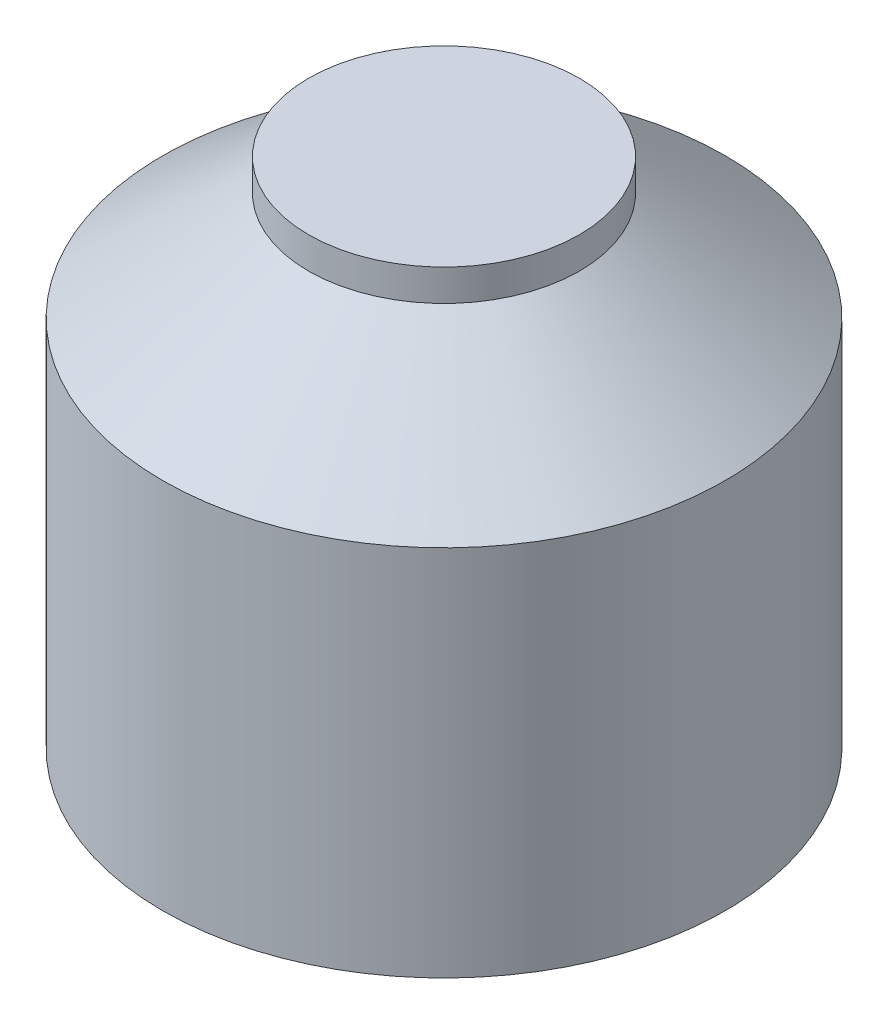
ISO-10303-21;
HEADER;
FILE_DESCRIPTION(('STEP AP214'),'2;1');
FILE_NAME('part.step','',(''),(''),'','','');
FILE_SCHEMA(('AUTOMOTIVE_DESIGN { 1 0 10303 214 1 1 1 1 }'));
ENDSEC;
DATA;
#1=APPLICATION_CONTEXT('core data for automotive mechanical design processes');
#2=APPLICATION_PROTOCOL_DEFINITION('international standard','automotive_design',2000,#1);
#3=PRODUCT_CONTEXT('',#1,'mechanical');
#4=PRODUCT('Part','Part','',(#3));
#5=PRODUCT_RELATED_PRODUCT_CATEGORY('part','',(#4));
#6=PRODUCT_DEFINITION_FORMATION('','',#4);
#7=PRODUCT_DEFINITION_CONTEXT('part definition',#1,'design');
#8=PRODUCT_DEFINITION('design','',#6,#7);
#9=PRODUCT_DEFINITION_SHAPE('','',#8);
#10=(LENGTH_UNIT() NAMED_UNIT(*) SI_UNIT(.MILLI.,.METRE.));
#11=(NAMED_UNIT(*) PLANE_ANGLE_UNIT() SI_UNIT($,.RADIAN.));
#12=(NAMED_UNIT(*) SI_UNIT($,.STERADIAN.) SOLID_ANGLE_UNIT());
#13=UNCERTAINTY_MEASURE_WITH_UNIT(LENGTH_MEASURE(1.E-05),#10,'distance_accuracy_value','');
#14=(GEOMETRIC_REPRESENTATION_CONTEXT(3) GLOBAL_UNCERTAINTY_ASSIGNED_CONTEXT((#13)) GLOBAL_UNIT_ASSIGNED_CONTEXT((#10,
#11,#12)) REPRESENTATION_CONTEXT('',''));
#15=CARTESIAN_POINT('',(0.,0.,0.));
#16=DIRECTION('',(0.,0.,1.));
#17=DIRECTION('',(1.,0.,0.));
#18=AXIS2_PLACEMENT_3D('',#15,#16,#17);
#19=CARTESIAN_POINT('',(37.529,0.,0.));
#20=DIRECTION('',(0.,1.,0.));
#21=DIRECTION('',(0.,0.,1.));
#22=AXIS2_PLACEMENT_3D('',#19,#20,#21);
#23=PLANE('',#22);
#24=CARTESIAN_POINT('',(0.,0.,0.));
#25=DIRECTION('',(0.,1.,0.));
#26=DIRECTION('',(0.,0.,1.));
#27=AXIS2_PLACEMENT_3D('',#24,#25,#26);
#28=CIRCLE('',#27,41.529);
#29=CARTESIAN_POINT('',(0.,0.,41.529));
#30=VERTEX_POINT('',#29);
#31=EDGE_CURVE('E10',#30,#30,#28,.T.);
#32=ORIENTED_EDGE('',*,*,#31,.F.);
#33=EDGE_LOOP('',(#32));
#34=FACE_BOUND('',#33,.T.);
#35=CARTESIAN_POINT('',(0.,0.,0.));
#36=DIRECTION('',(0.,1.,0.));
#37=DIRECTION('',(0.,0.,1.));
#38=AXIS2_PLACEMENT_3D('',#35,#36,#37);
#39=CIRCLE('',#38,37.529);
#40=CARTESIAN_POINT('',(0.,0.,37.529));
#41=VERTEX_POINT('',#40);
#42=EDGE_CURVE('E63',#41,#41,#39,.T.);
#43=ORIENTED_EDGE('',*,*,#42,.T.);
#44=EDGE_LOOP('',(#43));
#45=FACE_BOUND('',#44,.T.);
#46=ADVANCED_FACE('F35',(#34,#45),#23,.F.);
#47=CARTESIAN_POINT('',(0.,75.666,0.));
#48=DIRECTION('',(0.,1.,0.));
#49=DIRECTION('',(0.,0.,1.));
#50=AXIS2_PLACEMENT_3D('',#47,#48,#49);
#51=CYLINDRICAL_SURFACE('',#50,41.529);
#52=CARTESIAN_POINT('',(0.,55.,0.));
#53=DIRECTION('',(0.,1.,0.));
#54=DIRECTION('',(0.,0.,1.));
#55=AXIS2_PLACEMENT_3D('',#52,#53,#54);
#56=CIRCLE('',#55,41.529);
#57=CARTESIAN_POINT('',(0.,55.,41.529));
#58=VERTEX_POINT('',#57);
#59=EDGE_CURVE('E41',#58,#58,#56,.T.);
#60=ORIENTED_EDGE('',*,*,#59,.F.);
#61=EDGE_LOOP('',(#60));
#62=FACE_BOUND('',#61,.T.);
#63=ORIENTED_EDGE('',*,*,#31,.T.);
#64=EDGE_LOOP('',(#63));
#65=FACE_BOUND('',#64,.T.);
#66=ADVANCED_FACE('F97',(#62,#65),#51,.T.);
#67=CARTESIAN_POINT('',(0.,55.,0.));
#68=DIRECTION('',(0.,-1.,0.));
#69=DIRECTION('',(0.,0.,-1.));
#70=AXIS2_PLACEMENT_3D('',#67,#68,#69);
#71=CONICAL_SURFACE('',#70,41.529,0.931384710881349);
#72=CARTESIAN_POINT('',(0.,71.0096031746032,0.));
#73=DIRECTION('',(0.,1.,0.));
#74=DIRECTION('',(0.,0.,1.));
#75=AXIS2_PLACEMENT_3D('',#72,#73,#74);
#76=CIRCLE('',#75,20.);
#77=CARTESIAN_POINT('',(0.,71.0096031746032,20.));
#78=VERTEX_POINT('',#77);
#79=EDGE_CURVE('E45',#78,#78,#76,.T.);
#80=ORIENTED_EDGE('',*,*,#79,.F.);
#81=EDGE_LOOP('',(#80));
#82=FACE_BOUND('',#81,.T.);
#83=ORIENTED_EDGE('',*,*,#59,.T.);
#84=EDGE_LOOP('',(#83));
#85=FACE_BOUND('',#84,.T.);
#86=ADVANCED_FACE('F102',(#82,#85),#71,.T.);
#87=CARTESIAN_POINT('',(0.,75.666,0.));
#88=DIRECTION('',(0.,1.,0.));
#89=DIRECTION('',(0.,0.,1.));
#90=AXIS2_PLACEMENT_3D('',#87,#88,#89);
#91=CYLINDRICAL_SURFACE('',#90,20.);
#92=CARTESIAN_POINT('',(0.,75.666,0.));
#93=DIRECTION('',(0.,1.,0.));
#94=DIRECTION('',(0.,0.,1.));
#95=AXIS2_PLACEMENT_3D('',#92,#93,#94);
#96=CIRCLE('',#95,20.);
#97=CARTESIAN_POINT('',(0.,75.666,20.));
#98=VERTEX_POINT('',#97);
#99=EDGE_CURVE('E49',#98,#98,#96,.T.);
#100=ORIENTED_EDGE('',*,*,#99,.F.);
#101=EDGE_LOOP('',(#100));
#102=FACE_BOUND('',#101,.T.);
#103=ORIENTED_EDGE('',*,*,#79,.T.);
#104=EDGE_LOOP('',(#103));
#105=FACE_BOUND('',#104,.T.);
#106=ADVANCED_FACE('F93',(#102,#105),#91,.T.);
#107=CARTESIAN_POINT('',(20.,75.666,0.));
#108=DIRECTION('',(0.,-1.,0.));
#109=DIRECTION('',(0.,0.,-1.));
#110=AXIS2_PLACEMENT_3D('',#107,#108,#109);
#111=PLANE('',#110);
#112=ORIENTED_EDGE('',*,*,#99,.T.);
#113=EDGE_LOOP('',(#112));
#114=FACE_BOUND('',#113,.T.);
#115=ADVANCED_FACE('F88',(#114),#111,.F.);
#116=CARTESIAN_POINT('',(18.8207887943874,73.9449512064851,0.));
#117=DIRECTION('',(0.,1.,0.));
#118=DIRECTION('',(0.,0.,1.));
#119=AXIS2_PLACEMENT_3D('',#116,#117,#118);
#120=PLANE('',#119);
#121=CARTESIAN_POINT('',(0.,73.9449512064851,0.));
#122=DIRECTION('',(0.,1.,0.));
#123=DIRECTION('',(0.,0.,1.));
#124=AXIS2_PLACEMENT_3D('',#121,#122,#123);
#125=CIRCLE('',#124,18.8207887943874);
#126=CARTESIAN_POINT('',(0.,73.9449512064851,18.8207887943874));
#127=VERTEX_POINT('',#126);
#128=EDGE_CURVE('E54',#127,#127,#125,.T.);
#129=ORIENTED_EDGE('',*,*,#128,.F.);
#130=EDGE_LOOP('',(#129));
#131=FACE_BOUND('',#130,.T.);
#132=ADVANCED_FACE('F83',(#131),#120,.F.);
#133=CARTESIAN_POINT('',(0.,75.666,0.));
#134=DIRECTION('',(0.,1.,0.));
#135=DIRECTION('',(0.,0.,1.));
#136=AXIS2_PLACEMENT_3D('',#133,#134,#135);
#137=CYLINDRICAL_SURFACE('',#136,18.8207887943874);
#138=CARTESIAN_POINT('',(0.,66.901746723447,0.));
#139=DIRECTION('',(0.,1.,0.));
#140=DIRECTION('',(0.,0.,1.));
#141=AXIS2_PLACEMENT_3D('',#138,#139,#140);
#142=CIRCLE('',#141,18.8207887943874);
#143=CARTESIAN_POINT('',(0.,66.901746723447,18.8207887943874));
#144=VERTEX_POINT('',#143);
#145=EDGE_CURVE('E57',#144,#144,#142,.T.);
#146=ORIENTED_EDGE('',*,*,#145,.F.);
#147=EDGE_LOOP('',(#146));
#148=FACE_BOUND('',#147,.T.);
#149=ORIENTED_EDGE('',*,*,#128,.T.);
#150=EDGE_LOOP('',(#149));
#151=FACE_BOUND('',#150,.T.);
#152=ADVANCED_FACE('F77',(#148,#151),#137,.F.);
#153=CARTESIAN_POINT('',(0.,66.901746723447,0.));
#154=DIRECTION('',(0.,-1.,0.));
#155=DIRECTION('',(0.,0.,-1.));
#156=AXIS2_PLACEMENT_3D('',#153,#154,#155);
#157=CONICAL_SURFACE('',#156,18.8207887943874,0.931384710881349);
#158=CARTESIAN_POINT('',(0.,52.9897657903557,0.));
#159=DIRECTION('',(0.,1.,0.));
#160=DIRECTION('',(0.,0.,1.));
#161=AXIS2_PLACEMENT_3D('',#158,#159,#160);
#162=CIRCLE('',#161,37.529);
#163=CARTESIAN_POINT('',(0.,52.9897657903557,37.529));
#164=VERTEX_POINT('',#163);
#165=EDGE_CURVE('E60',#164,#164,#162,.T.);
#166=ORIENTED_EDGE('',*,*,#165,.F.);
#167=EDGE_LOOP('',(#166));
#168=FACE_BOUND('',#167,.T.);
#169=ORIENTED_EDGE('',*,*,#145,.T.);
#170=EDGE_LOOP('',(#169));
#171=FACE_BOUND('',#170,.T.);
#172=ADVANCED_FACE('F71',(#168,#171),#157,.F.);
#173=CARTESIAN_POINT('',(0.,75.666,0.));
#174=DIRECTION('',(0.,1.,0.));
#175=DIRECTION('',(0.,0.,1.));
#176=AXIS2_PLACEMENT_3D('',#173,#174,#175);
#177=CYLINDRICAL_SURFACE('',#176,37.529);
#178=ORIENTED_EDGE('',*,*,#42,.F.);
#179=EDGE_LOOP('',(#178));
#180=FACE_BOUND('',#179,.T.);
#181=ORIENTED_EDGE('',*,*,#165,.T.);
#182=EDGE_LOOP('',(#181));
#183=FACE_BOUND('',#182,.T.);
#184=ADVANCED_FACE('F68',(#180,#183),#177,.F.);
#185=CLOSED_SHELL('',(#46,#66,#86,#106,#115,#132,#152,#172,#184));
#186=MANIFOLD_SOLID_BREP('B2',#185);
#187=ADVANCED_BREP_SHAPE_REPRESENTATION('',(#18,#186),#14);
#188=SHAPE_DEFINITION_REPRESENTATION(#9,#187);
ENDSEC;
END-ISO-10303-21;
